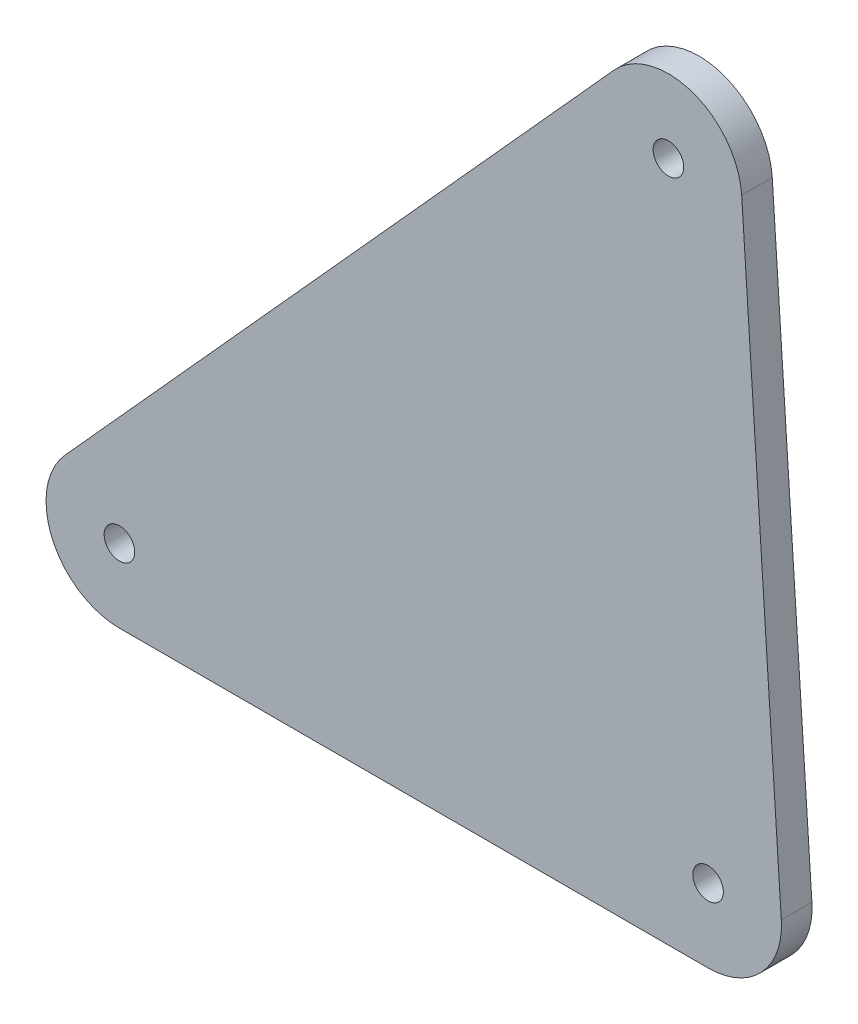
ISO-10303-21;
HEADER;
FILE_DESCRIPTION(('STEP AP214'),'2;1');
FILE_NAME('part.step','',(''),(''),'','','');
FILE_SCHEMA(('AUTOMOTIVE_DESIGN { 1 0 10303 214 1 1 1 1 }'));
ENDSEC;
DATA;
#1=APPLICATION_CONTEXT('core data for automotive mechanical design processes');
#2=APPLICATION_PROTOCOL_DEFINITION('international standard','automotive_design',2000,#1);
#3=PRODUCT_CONTEXT('',#1,'mechanical');
#4=PRODUCT('Part','Part','',(#3));
#5=PRODUCT_RELATED_PRODUCT_CATEGORY('part','',(#4));
#6=PRODUCT_DEFINITION_FORMATION('','',#4);
#7=PRODUCT_DEFINITION_CONTEXT('part definition',#1,'design');
#8=PRODUCT_DEFINITION('design','',#6,#7);
#9=PRODUCT_DEFINITION_SHAPE('','',#8);
#10=(LENGTH_UNIT() NAMED_UNIT(*) SI_UNIT(.MILLI.,.METRE.));
#11=(NAMED_UNIT(*) PLANE_ANGLE_UNIT() SI_UNIT($,.RADIAN.));
#12=(NAMED_UNIT(*) SI_UNIT($,.STERADIAN.) SOLID_ANGLE_UNIT());
#13=UNCERTAINTY_MEASURE_WITH_UNIT(LENGTH_MEASURE(1.E-05),#10,'distance_accuracy_value','');
#14=(GEOMETRIC_REPRESENTATION_CONTEXT(3) GLOBAL_UNCERTAINTY_ASSIGNED_CONTEXT((#13)) GLOBAL_UNIT_ASSIGNED_CONTEXT((#10,
#11,#12)) REPRESENTATION_CONTEXT('',''));
#15=CARTESIAN_POINT('',(0.,0.,0.));
#16=DIRECTION('',(0.,0.,1.));
#17=DIRECTION('',(1.,0.,0.));
#18=AXIS2_PLACEMENT_3D('',#15,#16,#17);
#19=CARTESIAN_POINT('',(96.2399998438047,-43.6944124892829,-23.206005243));
#20=DIRECTION('',(0.,0.,1.));
#21=DIRECTION('',(1.,0.,0.));
#22=AXIS2_PLACEMENT_3D('',#19,#20,#21);
#23=CYLINDRICAL_SURFACE('',#22,11.9999999885387);
#24=CARTESIAN_POINT('',(96.2399998438047,-43.6944124892829,-18.206005243));
#25=DIRECTION('',(0.,0.,1.));
#26=DIRECTION('',(1.,0.,0.));
#27=AXIS2_PLACEMENT_3D('',#24,#25,#26);
#28=CIRCLE('',#27,11.9999999885387);
#29=CARTESIAN_POINT('',(96.2399998438047,-55.6944124778216,-18.206005243));
#30=VERTEX_POINT('',#29);
#31=CARTESIAN_POINT('',(108.214557081093,-42.9134011604004,-18.206005243));
#32=VERTEX_POINT('',#31);
#33=EDGE_CURVE('E122',#30,#32,#28,.T.);
#34=ORIENTED_EDGE('',*,*,#33,.F.);
#35=DIRECTION('',(0.,0.,1.));
#36=VECTOR('',#35,1.);
#37=CARTESIAN_POINT('',(96.2399998438047,-55.6944124778216,-23.206005243));
#38=LINE('',#37,#36);
#39=CARTESIAN_POINT('',(96.2399998438047,-55.6944124778216,-23.206005243));
#40=VERTEX_POINT('',#39);
#41=EDGE_CURVE('E11',#40,#30,#38,.T.);
#42=ORIENTED_EDGE('',*,*,#41,.F.);
#43=CARTESIAN_POINT('',(96.2399998438047,-43.6944124892829,-23.206005243));
#44=DIRECTION('',(0.,0.,1.));
#45=DIRECTION('',(1.,0.,0.));
#46=AXIS2_PLACEMENT_3D('',#43,#44,#45);
#47=CIRCLE('',#46,11.9999999885387);
#48=CARTESIAN_POINT('',(108.214557081093,-42.9134011604004,-23.206005243));
#49=VERTEX_POINT('',#48);
#50=EDGE_CURVE('E137',#40,#49,#47,.T.);
#51=ORIENTED_EDGE('',*,*,#50,.T.);
#52=DIRECTION('',(0.,0.,1.));
#53=VECTOR('',#52,1.);
#54=CARTESIAN_POINT('',(108.214557081093,-42.9134011604004,-23.206005243));
#55=LINE('',#54,#53);
#56=EDGE_CURVE('E40',#49,#32,#55,.T.);
#57=ORIENTED_EDGE('',*,*,#56,.T.);
#58=EDGE_LOOP('',(#34,#42,#51,#57));
#59=FACE_BOUND('',#58,.T.);
#60=ADVANCED_FACE('F37',(#59),#23,.T.);
#61=CARTESIAN_POINT('',(0.,-55.6944124778216,-23.206005243));
#62=DIRECTION('',(0.,-1.,0.));
#63=DIRECTION('',(1.,0.,0.));
#64=AXIS2_PLACEMENT_3D('',#61,#62,#63);
#65=PLANE('',#64);
#66=DIRECTION('',(1.,0.,0.));
#67=VECTOR('',#66,1.);
#68=CARTESIAN_POINT('',(0.,-55.6944124778216,-18.206005243));
#69=LINE('',#68,#67);
#70=CARTESIAN_POINT('',(0.,-55.6944124778216,-18.206005243));
#71=VERTEX_POINT('',#70);
#72=EDGE_CURVE('E135',#71,#30,#69,.T.);
#73=ORIENTED_EDGE('',*,*,#72,.F.);
#74=DIRECTION('',(0.,0.,1.));
#75=VECTOR('',#74,1.);
#76=CARTESIAN_POINT('',(0.,-55.6944124778216,-23.206005243));
#77=LINE('',#76,#75);
#78=CARTESIAN_POINT('',(0.,-55.6944124778216,-23.206005243));
#79=VERTEX_POINT('',#78);
#80=EDGE_CURVE('E46',#79,#71,#77,.T.);
#81=ORIENTED_EDGE('',*,*,#80,.F.);
#82=DIRECTION('',(1.,0.,0.));
#83=VECTOR('',#82,1.);
#84=CARTESIAN_POINT('',(0.,-55.6944124778216,-23.206005243));
#85=LINE('',#84,#83);
#86=EDGE_CURVE('E112',#79,#40,#85,.T.);
#87=ORIENTED_EDGE('',*,*,#86,.T.);
#88=ORIENTED_EDGE('',*,*,#41,.T.);
#89=EDGE_LOOP('',(#73,#81,#87,#88));
#90=FACE_BOUND('',#89,.T.);
#91=ADVANCED_FACE('F145',(#90),#65,.T.);
#92=CARTESIAN_POINT('',(0.,-43.6944124817445,-23.206005243));
#93=DIRECTION('',(0.,0.,1.));
#94=DIRECTION('',(1.,0.,0.));
#95=AXIS2_PLACEMENT_3D('',#92,#93,#94);
#96=CYLINDRICAL_SURFACE('',#95,11.9999999960771);
#97=CARTESIAN_POINT('',(0.,-43.6944124817445,-18.206005243));
#98=DIRECTION('',(0.,0.,1.));
#99=DIRECTION('',(1.,0.,0.));
#100=AXIS2_PLACEMENT_3D('',#97,#98,#99);
#101=CIRCLE('',#100,11.9999999960771);
#102=CARTESIAN_POINT('',(-8.90580870191353,-35.6516162471771,-18.206005243));
#103=VERTEX_POINT('',#102);
#104=EDGE_CURVE('E99',#103,#71,#101,.T.);
#105=ORIENTED_EDGE('',*,*,#104,.F.);
#106=DIRECTION('',(0.,0.,1.));
#107=VECTOR('',#106,1.);
#108=CARTESIAN_POINT('',(-8.90580870191353,-35.6516162471771,-23.206005243));
#109=LINE('',#108,#107);
#110=CARTESIAN_POINT('',(-8.90580870191353,-35.6516162471771,-23.206005243));
#111=VERTEX_POINT('',#110);
#112=EDGE_CURVE('E94',#111,#103,#109,.T.);
#113=ORIENTED_EDGE('',*,*,#112,.F.);
#114=CARTESIAN_POINT('',(0.,-43.6944124817445,-23.206005243));
#115=DIRECTION('',(0.,0.,1.));
#116=DIRECTION('',(1.,0.,0.));
#117=AXIS2_PLACEMENT_3D('',#114,#115,#116);
#118=CIRCLE('',#117,11.9999999960771);
#119=EDGE_CURVE('E97',#111,#79,#118,.T.);
#120=ORIENTED_EDGE('',*,*,#119,.T.);
#121=ORIENTED_EDGE('',*,*,#80,.T.);
#122=EDGE_LOOP('',(#105,#113,#120,#121));
#123=FACE_BOUND('',#122,.T.);
#124=ADVANCED_FACE('F96',(#123),#96,.T.);
#125=CARTESIAN_POINT('',(80.8517971359318,63.7372087112362,-23.206005243));
#126=DIRECTION('',(-0.742150725402075,0.67023301976639,0.));
#127=DIRECTION('',(-0.67023301976639,-0.742150725402075,0.));
#128=AXIS2_PLACEMENT_3D('',#125,#126,#127);
#129=PLANE('',#128);
#130=DIRECTION('',(-0.67023301976639,-0.742150725402075,0.));
#131=VECTOR('',#130,1.);
#132=CARTESIAN_POINT('',(80.8517971359318,63.7372087112362,-18.206005243));
#133=LINE('',#132,#131);
#134=CARTESIAN_POINT('',(80.8517971359318,63.7372087112362,-18.206005243));
#135=VERTEX_POINT('',#134);
#136=EDGE_CURVE('E132',#135,#103,#133,.T.);
#137=ORIENTED_EDGE('',*,*,#136,.F.);
#138=DIRECTION('',(0.,0.,1.));
#139=VECTOR('',#138,1.);
#140=CARTESIAN_POINT('',(80.8517971359318,63.7372087112362,-23.206005243));
#141=LINE('',#140,#139);
#142=CARTESIAN_POINT('',(80.8517971359318,63.7372087112362,-23.206005243));
#143=VERTEX_POINT('',#142);
#144=EDGE_CURVE('E104',#143,#135,#141,.T.);
#145=ORIENTED_EDGE('',*,*,#144,.F.);
#146=DIRECTION('',(-0.67023301976639,-0.742150725402075,0.));
#147=VECTOR('',#146,1.);
#148=CARTESIAN_POINT('',(80.8517971359318,63.7372087112362,-23.206005243));
#149=LINE('',#148,#147);
#150=EDGE_CURVE('E110',#143,#111,#149,.T.);
#151=ORIENTED_EDGE('',*,*,#150,.T.);
#152=ORIENTED_EDGE('',*,*,#112,.T.);
#153=EDGE_LOOP('',(#137,#145,#151,#152));
#154=FACE_BOUND('',#153,.T.);
#155=ADVANCED_FACE('F114',(#154),#129,.T.);
#156=CARTESIAN_POINT('',(89.7576058271238,55.6944124863513,-23.206005243));
#157=DIRECTION('',(0.,0.,1.));
#158=DIRECTION('',(1.,0.,0.));
#159=AXIS2_PLACEMENT_3D('',#156,#157,#158);
#160=CYLINDRICAL_SURFACE('',#159,11.9999999816305);
#161=CARTESIAN_POINT('',(89.7576058271238,55.6944124863513,-18.206005243));
#162=DIRECTION('',(0.,0.,1.));
#163=DIRECTION('',(1.,0.,0.));
#164=AXIS2_PLACEMENT_3D('',#161,#162,#163);
#165=CIRCLE('',#164,11.9999999816305);
#166=CARTESIAN_POINT('',(101.732163057518,56.4754238147843,-18.206005243));
#167=VERTEX_POINT('',#166);
#168=EDGE_CURVE('E129',#167,#135,#165,.T.);
#169=ORIENTED_EDGE('',*,*,#168,.F.);
#170=DIRECTION('',(0.,0.,1.));
#171=VECTOR('',#170,1.);
#172=CARTESIAN_POINT('',(101.732163057518,56.4754238147843,-23.206005243));
#173=LINE('',#172,#171);
#174=CARTESIAN_POINT('',(101.732163057518,56.4754238147843,-23.206005243));
#175=VERTEX_POINT('',#174);
#176=EDGE_CURVE('E140',#175,#167,#173,.T.);
#177=ORIENTED_EDGE('',*,*,#176,.F.);
#178=CARTESIAN_POINT('',(89.7576058271238,55.6944124863513,-23.206005243));
#179=DIRECTION('',(0.,0.,1.));
#180=DIRECTION('',(1.,0.,0.));
#181=AXIS2_PLACEMENT_3D('',#178,#179,#180);
#182=CIRCLE('',#181,11.9999999816305);
#183=EDGE_CURVE('E115',#175,#143,#182,.T.);
#184=ORIENTED_EDGE('',*,*,#183,.T.);
#185=ORIENTED_EDGE('',*,*,#144,.T.);
#186=EDGE_LOOP('',(#169,#177,#184,#185));
#187=FACE_BOUND('',#186,.T.);
#188=ADVANCED_FACE('F158',(#187),#160,.T.);
#189=CARTESIAN_POINT('',(108.214557081093,-42.9134011604004,-23.206005243));
#190=DIRECTION('',(0.997879770727081,0.0650842774690432,0.));
#191=DIRECTION('',(-0.0650842774690432,0.997879770727081,0.));
#192=AXIS2_PLACEMENT_3D('',#189,#190,#191);
#193=PLANE('',#192);
#194=DIRECTION('',(-0.0650842774690432,0.997879770727081,0.));
#195=VECTOR('',#194,1.);
#196=CARTESIAN_POINT('',(108.214557081093,-42.9134011604004,-18.206005243));
#197=LINE('',#196,#195);
#198=EDGE_CURVE('E125',#32,#167,#197,.T.);
#199=ORIENTED_EDGE('',*,*,#198,.F.);
#200=ORIENTED_EDGE('',*,*,#56,.F.);
#201=DIRECTION('',(-0.0650842774690432,0.997879770727081,0.));
#202=VECTOR('',#201,1.);
#203=CARTESIAN_POINT('',(108.214557081093,-42.9134011604004,-23.206005243));
#204=LINE('',#203,#202);
#205=EDGE_CURVE('E117',#49,#175,#204,.T.);
#206=ORIENTED_EDGE('',*,*,#205,.T.);
#207=ORIENTED_EDGE('',*,*,#176,.T.);
#208=EDGE_LOOP('',(#199,#200,#206,#207));
#209=FACE_BOUND('',#208,.T.);
#210=ADVANCED_FACE('F142',(#209),#193,.T.);
#211=CARTESIAN_POINT('',(96.2399998438047,-43.6944124892829,-23.206005243));
#212=DIRECTION('',(0.,0.,1.));
#213=DIRECTION('',(1.,0.,0.));
#214=AXIS2_PLACEMENT_3D('',#211,#212,#213);
#215=PLANE('',#214);
#216=CARTESIAN_POINT('',(0.,-43.6944124817445,-23.206005243));
#217=DIRECTION('',(0.,0.,1.));
#218=DIRECTION('',(-1.,0.,0.));
#219=AXIS2_PLACEMENT_3D('',#216,#217,#218);
#220=CIRCLE('',#219,2.5);
#221=CARTESIAN_POINT('',(-2.5,-43.6944124817445,-23.206005243));
#222=VERTEX_POINT('',#221);
#223=EDGE_CURVE('E188',#222,#222,#220,.T.);
#224=ORIENTED_EDGE('',*,*,#223,.T.);
#225=EDGE_LOOP('',(#224));
#226=FACE_BOUND('',#225,.T.);
#227=CARTESIAN_POINT('',(96.2399998438047,-43.6944124892829,-23.206005243));
#228=DIRECTION('',(0.,0.,1.));
#229=DIRECTION('',(-1.,0.,0.));
#230=AXIS2_PLACEMENT_3D('',#227,#228,#229);
#231=CIRCLE('',#230,2.50000000000001);
#232=CARTESIAN_POINT('',(93.7399998438047,-43.6944124892829,-23.206005243));
#233=VERTEX_POINT('',#232);
#234=EDGE_CURVE('E196',#233,#233,#231,.T.);
#235=ORIENTED_EDGE('',*,*,#234,.T.);
#236=EDGE_LOOP('',(#235));
#237=FACE_BOUND('',#236,.T.);
#238=CARTESIAN_POINT('',(89.7576058271238,55.6944124863513,-23.206005243));
#239=DIRECTION('',(0.,0.,1.));
#240=DIRECTION('',(-1.,0.,0.));
#241=AXIS2_PLACEMENT_3D('',#238,#239,#240);
#242=CIRCLE('',#241,2.50000000000001);
#243=CARTESIAN_POINT('',(87.2576058271237,55.6944124863513,-23.206005243));
#244=VERTEX_POINT('',#243);
#245=EDGE_CURVE('E126',#244,#244,#242,.T.);
#246=ORIENTED_EDGE('',*,*,#245,.T.);
#247=EDGE_LOOP('',(#246));
#248=FACE_BOUND('',#247,.T.);
#249=ORIENTED_EDGE('',*,*,#50,.F.);
#250=ORIENTED_EDGE('',*,*,#86,.F.);
#251=ORIENTED_EDGE('',*,*,#119,.F.);
#252=ORIENTED_EDGE('',*,*,#150,.F.);
#253=ORIENTED_EDGE('',*,*,#183,.F.);
#254=ORIENTED_EDGE('',*,*,#205,.F.);
#255=EDGE_LOOP('',(#249,#250,#251,#252,#253,#254));
#256=FACE_BOUND('',#255,.T.);
#257=ADVANCED_FACE('F108',(#226,#237,#248,#256),#215,.F.);
#258=CARTESIAN_POINT('',(96.2399998438047,-43.6944124892829,-18.206005243));
#259=DIRECTION('',(0.,0.,1.));
#260=DIRECTION('',(1.,0.,0.));
#261=AXIS2_PLACEMENT_3D('',#258,#259,#260);
#262=PLANE('',#261);
#263=CARTESIAN_POINT('',(0.,-43.6944124817445,-18.206005243));
#264=DIRECTION('',(0.,0.,1.));
#265=DIRECTION('',(-1.,0.,0.));
#266=AXIS2_PLACEMENT_3D('',#263,#264,#265);
#267=CIRCLE('',#266,2.5);
#268=CARTESIAN_POINT('',(-2.5,-43.6944124817445,-18.206005243));
#269=VERTEX_POINT('',#268);
#270=EDGE_CURVE('E191',#269,#269,#267,.T.);
#271=ORIENTED_EDGE('',*,*,#270,.F.);
#272=EDGE_LOOP('',(#271));
#273=FACE_BOUND('',#272,.T.);
#274=CARTESIAN_POINT('',(96.2399998438047,-43.6944124892829,-18.206005243));
#275=DIRECTION('',(0.,0.,1.));
#276=DIRECTION('',(-1.,0.,0.));
#277=AXIS2_PLACEMENT_3D('',#274,#275,#276);
#278=CIRCLE('',#277,2.50000000000001);
#279=CARTESIAN_POINT('',(93.7399998438047,-43.6944124892829,-18.206005243));
#280=VERTEX_POINT('',#279);
#281=EDGE_CURVE('E193',#280,#280,#278,.T.);
#282=ORIENTED_EDGE('',*,*,#281,.F.);
#283=EDGE_LOOP('',(#282));
#284=FACE_BOUND('',#283,.T.);
#285=CARTESIAN_POINT('',(89.7576058271238,55.6944124863513,-18.206005243));
#286=DIRECTION('',(0.,0.,1.));
#287=DIRECTION('',(-1.,0.,0.));
#288=AXIS2_PLACEMENT_3D('',#285,#286,#287);
#289=CIRCLE('',#288,2.50000000000001);
#290=CARTESIAN_POINT('',(87.2576058271237,55.6944124863513,-18.206005243));
#291=VERTEX_POINT('',#290);
#292=EDGE_CURVE('E199',#291,#291,#289,.T.);
#293=ORIENTED_EDGE('',*,*,#292,.F.);
#294=EDGE_LOOP('',(#293));
#295=FACE_BOUND('',#294,.T.);
#296=ORIENTED_EDGE('',*,*,#33,.T.);
#297=ORIENTED_EDGE('',*,*,#198,.T.);
#298=ORIENTED_EDGE('',*,*,#168,.T.);
#299=ORIENTED_EDGE('',*,*,#136,.T.);
#300=ORIENTED_EDGE('',*,*,#104,.T.);
#301=ORIENTED_EDGE('',*,*,#72,.T.);
#302=EDGE_LOOP('',(#296,#297,#298,#299,#300,#301));
#303=FACE_BOUND('',#302,.T.);
#304=ADVANCED_FACE('F144',(#273,#284,#295,#303),#262,.T.);
#305=CARTESIAN_POINT('',(89.7576058271238,55.6944124863513,-23.206005243));
#306=DIRECTION('',(0.,0.,1.));
#307=DIRECTION('',(1.,0.,0.));
#308=AXIS2_PLACEMENT_3D('',#305,#306,#307);
#309=CYLINDRICAL_SURFACE('',#308,2.50000000000001);
#310=ORIENTED_EDGE('',*,*,#245,.F.);
#311=EDGE_LOOP('',(#310));
#312=FACE_BOUND('',#311,.T.);
#313=ORIENTED_EDGE('',*,*,#292,.T.);
#314=EDGE_LOOP('',(#313));
#315=FACE_BOUND('',#314,.T.);
#316=ADVANCED_FACE('F169',(#312,#315),#309,.F.);
#317=CARTESIAN_POINT('',(96.2399998438047,-43.6944124892829,-23.206005243));
#318=DIRECTION('',(0.,0.,1.));
#319=DIRECTION('',(1.,0.,0.));
#320=AXIS2_PLACEMENT_3D('',#317,#318,#319);
#321=CYLINDRICAL_SURFACE('',#320,2.50000000000001);
#322=ORIENTED_EDGE('',*,*,#234,.F.);
#323=EDGE_LOOP('',(#322));
#324=FACE_BOUND('',#323,.T.);
#325=ORIENTED_EDGE('',*,*,#281,.T.);
#326=EDGE_LOOP('',(#325));
#327=FACE_BOUND('',#326,.T.);
#328=ADVANCED_FACE('F176',(#324,#327),#321,.F.);
#329=CARTESIAN_POINT('',(0.,-43.6944124817445,-23.206005243));
#330=DIRECTION('',(0.,0.,1.));
#331=DIRECTION('',(1.,0.,0.));
#332=AXIS2_PLACEMENT_3D('',#329,#330,#331);
#333=CYLINDRICAL_SURFACE('',#332,2.5);
#334=ORIENTED_EDGE('',*,*,#223,.F.);
#335=EDGE_LOOP('',(#334));
#336=FACE_BOUND('',#335,.T.);
#337=ORIENTED_EDGE('',*,*,#270,.T.);
#338=EDGE_LOOP('',(#337));
#339=FACE_BOUND('',#338,.T.);
#340=ADVANCED_FACE('F180',(#336,#339),#333,.F.);
#341=CLOSED_SHELL('',(#60,#91,#124,#155,#188,#210,#257,#304,#316,#328,#340));
#342=MANIFOLD_SOLID_BREP('B2',#341);
#343=ADVANCED_BREP_SHAPE_REPRESENTATION('',(#18,#342),#14);
#344=SHAPE_DEFINITION_REPRESENTATION(#9,#343);
ENDSEC;
END-ISO-10303-21;
